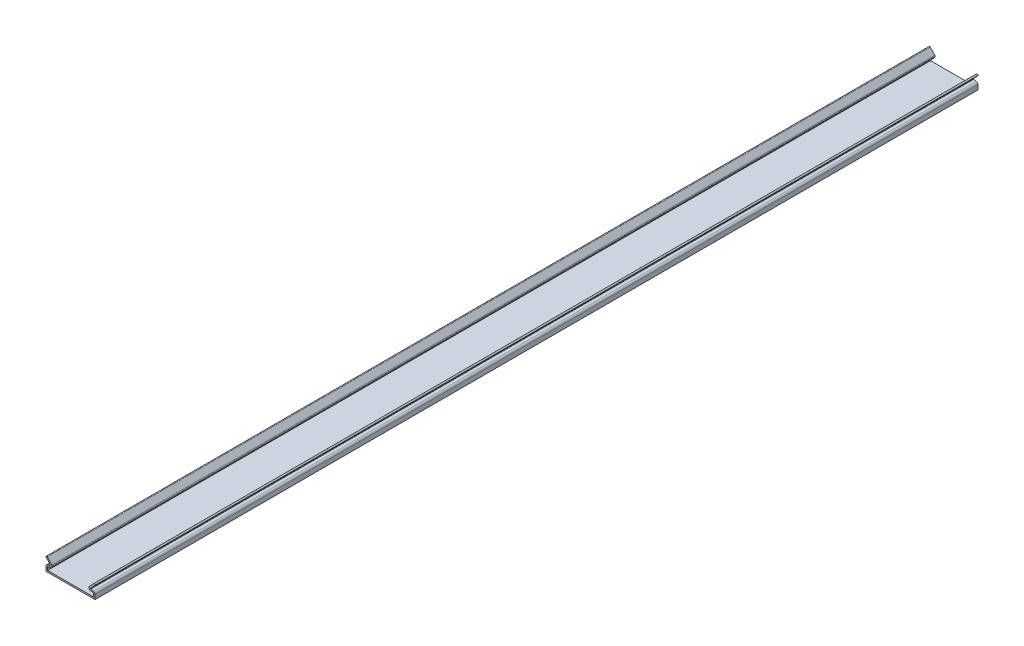
ISO-10303-21;
HEADER;
FILE_DESCRIPTION(('STEP AP214'),'2;1');
FILE_NAME('part.step','',(''),(''),'','','');
FILE_SCHEMA(('AUTOMOTIVE_DESIGN { 1 0 10303 214 1 1 1 1 }'));
ENDSEC;
DATA;
#1=APPLICATION_CONTEXT('core data for automotive mechanical design processes');
#2=APPLICATION_PROTOCOL_DEFINITION('international standard','automotive_design',2000,#1);
#3=PRODUCT_CONTEXT('',#1,'mechanical');
#4=PRODUCT('Part','Part','',(#3));
#5=PRODUCT_RELATED_PRODUCT_CATEGORY('part','',(#4));
#6=PRODUCT_DEFINITION_FORMATION('','',#4);
#7=PRODUCT_DEFINITION_CONTEXT('part definition',#1,'design');
#8=PRODUCT_DEFINITION('design','',#6,#7);
#9=PRODUCT_DEFINITION_SHAPE('','',#8);
#10=(LENGTH_UNIT() NAMED_UNIT(*) SI_UNIT(.MILLI.,.METRE.));
#11=(NAMED_UNIT(*) PLANE_ANGLE_UNIT() SI_UNIT($,.RADIAN.));
#12=(NAMED_UNIT(*) SI_UNIT($,.STERADIAN.) SOLID_ANGLE_UNIT());
#13=UNCERTAINTY_MEASURE_WITH_UNIT(LENGTH_MEASURE(1.E-05),#10,'distance_accuracy_value','');
#14=(GEOMETRIC_REPRESENTATION_CONTEXT(3) GLOBAL_UNCERTAINTY_ASSIGNED_CONTEXT((#13)) GLOBAL_UNIT_ASSIGNED_CONTEXT((#10,
#11,#12)) REPRESENTATION_CONTEXT('',''));
#15=CARTESIAN_POINT('',(0.,0.,0.));
#16=DIRECTION('',(0.,0.,1.));
#17=DIRECTION('',(1.,0.,0.));
#18=AXIS2_PLACEMENT_3D('',#15,#16,#17);
#19=CARTESIAN_POINT('',(6.96256025228649,-71.2888324619271,360.));
#20=DIRECTION('',(0.,1.,0.));
#21=DIRECTION('',(0.,0.,1.));
#22=AXIS2_PLACEMENT_3D('',#19,#20,#21);
#23=PLANE('',#22);
#24=DIRECTION('',(1.,0.,0.));
#25=VECTOR('',#24,1.);
#26=CARTESIAN_POINT('',(6.96256025228649,-71.2888324619271,-360.));
#27=LINE('',#26,#25);
#28=CARTESIAN_POINT('',(6.96256025228649,-71.2888324619271,-360.));
#29=VERTEX_POINT('',#28);
#30=CARTESIAN_POINT('',(46.9625602522865,-71.2888324619271,-360.));
#31=VERTEX_POINT('',#30);
#32=EDGE_CURVE('E255',#29,#31,#27,.T.);
#33=ORIENTED_EDGE('',*,*,#32,.T.);
#34=DIRECTION('',(0.,0.,-1.));
#35=VECTOR('',#34,1.);
#36=CARTESIAN_POINT('',(46.9625602522865,-71.2888324619271,360.));
#37=LINE('',#36,#35);
#38=CARTESIAN_POINT('',(46.9625602522865,-71.2888324619271,360.));
#39=VERTEX_POINT('',#38);
#40=EDGE_CURVE('E11',#39,#31,#37,.T.);
#41=ORIENTED_EDGE('',*,*,#40,.F.);
#42=DIRECTION('',(1.,0.,0.));
#43=VECTOR('',#42,1.);
#44=CARTESIAN_POINT('',(6.96256025228649,-71.2888324619271,360.));
#45=LINE('',#44,#43);
#46=CARTESIAN_POINT('',(6.96256025228649,-71.2888324619271,360.));
#47=VERTEX_POINT('',#46);
#48=EDGE_CURVE('E309',#47,#39,#45,.T.);
#49=ORIENTED_EDGE('',*,*,#48,.F.);
#50=DIRECTION('',(0.,0.,-1.));
#51=VECTOR('',#50,1.);
#52=CARTESIAN_POINT('',(6.96256025228649,-71.2888324619271,360.));
#53=LINE('',#52,#51);
#54=EDGE_CURVE('E251',#47,#29,#53,.T.);
#55=ORIENTED_EDGE('',*,*,#54,.T.);
#56=EDGE_LOOP('',(#33,#41,#49,#55));
#57=FACE_BOUND('',#56,.T.);
#58=ADVANCED_FACE('F39',(#57),#23,.F.);
#59=CARTESIAN_POINT('',(46.9625602522865,-71.2888324619271,360.));
#60=DIRECTION('',(-1.,0.,0.));
#61=DIRECTION('',(0.,0.,1.));
#62=AXIS2_PLACEMENT_3D('',#59,#60,#61);
#63=PLANE('',#62);
#64=DIRECTION('',(0.,1.,0.));
#65=VECTOR('',#64,1.);
#66=CARTESIAN_POINT('',(46.9625602522865,-71.2888324619271,-360.));
#67=LINE('',#66,#65);
#68=CARTESIAN_POINT('',(46.9625602522865,-67.5355315897852,-360.));
#69=VERTEX_POINT('',#68);
#70=EDGE_CURVE('E258',#31,#69,#67,.T.);
#71=ORIENTED_EDGE('',*,*,#70,.T.);
#72=DIRECTION('',(0.,0.,-1.));
#73=VECTOR('',#72,1.);
#74=CARTESIAN_POINT('',(46.9625602522865,-67.5355315897852,360.));
#75=LINE('',#74,#73);
#76=CARTESIAN_POINT('',(46.9625602522865,-67.5355315897852,360.));
#77=VERTEX_POINT('',#76);
#78=EDGE_CURVE('E47',#77,#69,#75,.T.);
#79=ORIENTED_EDGE('',*,*,#78,.F.);
#80=DIRECTION('',(0.,1.,0.));
#81=VECTOR('',#80,1.);
#82=CARTESIAN_POINT('',(46.9625602522865,-71.2888324619271,360.));
#83=LINE('',#82,#81);
#84=EDGE_CURVE('E158',#39,#77,#83,.T.);
#85=ORIENTED_EDGE('',*,*,#84,.F.);
#86=ORIENTED_EDGE('',*,*,#40,.T.);
#87=EDGE_LOOP('',(#71,#79,#85,#86));
#88=FACE_BOUND('',#87,.T.);
#89=ADVANCED_FACE('F467',(#88),#63,.F.);
#90=CARTESIAN_POINT('',(45.3625602522865,-67.5355315897852,360.));
#91=DIRECTION('',(0.,0.,-1.));
#92=DIRECTION('',(-1.,0.,0.));
#93=AXIS2_PLACEMENT_3D('',#90,#91,#92);
#94=CYLINDRICAL_SURFACE('',#93,1.59999999999999);
#95=CARTESIAN_POINT('',(45.3625602522865,-67.5355315897852,-360.));
#96=DIRECTION('',(0.,0.,1.));
#97=DIRECTION('',(1.,0.,0.));
#98=AXIS2_PLACEMENT_3D('',#95,#96,#97);
#99=CIRCLE('',#98,1.59999999999999);
#100=CARTESIAN_POINT('',(45.6403973365536,-65.9598391849657,-360.));
#101=VERTEX_POINT('',#100);
#102=EDGE_CURVE('E260',#69,#101,#99,.T.);
#103=ORIENTED_EDGE('',*,*,#102,.T.);
#104=DIRECTION('',(0.,0.,-1.));
#105=VECTOR('',#104,1.);
#106=CARTESIAN_POINT('',(45.6403973365536,-65.9598391849657,360.));
#107=LINE('',#106,#105);
#108=CARTESIAN_POINT('',(45.6403973365536,-65.9598391849657,360.));
#109=VERTEX_POINT('',#108);
#110=EDGE_CURVE('E376',#109,#101,#107,.T.);
#111=ORIENTED_EDGE('',*,*,#110,.F.);
#112=CARTESIAN_POINT('',(45.3625602522865,-67.5355315897852,360.));
#113=DIRECTION('',(0.,0.,1.));
#114=DIRECTION('',(1.,0.,0.));
#115=AXIS2_PLACEMENT_3D('',#112,#113,#114);
#116=CIRCLE('',#115,1.59999999999999);
#117=EDGE_CURVE('E384',#77,#109,#116,.T.);
#118=ORIENTED_EDGE('',*,*,#117,.F.);
#119=ORIENTED_EDGE('',*,*,#78,.T.);
#120=EDGE_LOOP('',(#103,#111,#118,#119));
#121=FACE_BOUND('',#120,.T.);
#122=ADVANCED_FACE('F382',(#121),#94,.T.);
#123=CARTESIAN_POINT('',(45.6403973365536,-65.9598391849657,360.));
#124=DIRECTION('',(-0.173648177666941,-0.984807753012206,0.));
#125=DIRECTION('',(0.984807753012206,-0.173648177666941,0.));
#126=AXIS2_PLACEMENT_3D('',#123,#124,#125);
#127=PLANE('',#126);
#128=DIRECTION('',(-0.984807753012206,0.173648177666941,0.));
#129=VECTOR('',#128,1.);
#130=CARTESIAN_POINT('',(45.6403973365536,-65.9598391849657,-360.));
#131=LINE('',#130,#129);
#132=CARTESIAN_POINT('',(43.5104657989864,-65.5842747878307,-360.));
#133=VERTEX_POINT('',#132);
#134=EDGE_CURVE('E262',#101,#133,#131,.T.);
#135=ORIENTED_EDGE('',*,*,#134,.T.);
#136=DIRECTION('',(0.,0.,-1.));
#137=VECTOR('',#136,1.);
#138=CARTESIAN_POINT('',(43.5104657989864,-65.5842747878307,360.));
#139=LINE('',#138,#137);
#140=CARTESIAN_POINT('',(43.5104657989864,-65.5842747878307,360.));
#141=VERTEX_POINT('',#140);
#142=EDGE_CURVE('E373',#141,#133,#139,.T.);
#143=ORIENTED_EDGE('',*,*,#142,.F.);
#144=DIRECTION('',(-0.984807753012206,0.173648177666941,0.));
#145=VECTOR('',#144,1.);
#146=CARTESIAN_POINT('',(45.6403973365536,-65.9598391849657,360.));
#147=LINE('',#146,#145);
#148=EDGE_CURVE('E402',#109,#141,#147,.T.);
#149=ORIENTED_EDGE('',*,*,#148,.F.);
#150=ORIENTED_EDGE('',*,*,#110,.T.);
#151=EDGE_LOOP('',(#135,#143,#149,#150));
#152=FACE_BOUND('',#151,.T.);
#153=ADVANCED_FACE('F393',(#152),#127,.F.);
#154=CARTESIAN_POINT('',(43.5625602522865,-65.2888324619271,360.));
#155=DIRECTION('',(0.,0.,-1.));
#156=DIRECTION('',(-1.,0.,0.));
#157=AXIS2_PLACEMENT_3D('',#154,#155,#156);
#158=CYLINDRICAL_SURFACE('',#157,0.299999999999976);
#159=CARTESIAN_POINT('',(43.5625602522865,-65.2888324619271,-360.));
#160=DIRECTION('',(0.,0.,-1.));
#161=DIRECTION('',(1.,0.,0.));
#162=AXIS2_PLACEMENT_3D('',#159,#160,#161);
#163=CIRCLE('',#162,0.299999999999976);
#164=CARTESIAN_POINT('',(43.3431541418008,-65.0842329539084,-360.));
#165=VERTEX_POINT('',#164);
#166=EDGE_CURVE('E264',#133,#165,#163,.T.);
#167=ORIENTED_EDGE('',*,*,#166,.T.);
#168=DIRECTION('',(0.,0.,-1.));
#169=VECTOR('',#168,1.);
#170=CARTESIAN_POINT('',(43.3431541418008,-65.0842329539084,360.));
#171=LINE('',#170,#169);
#172=CARTESIAN_POINT('',(43.3431541418008,-65.0842329539084,360.));
#173=VERTEX_POINT('',#172);
#174=EDGE_CURVE('E370',#173,#165,#171,.T.);
#175=ORIENTED_EDGE('',*,*,#174,.F.);
#176=CARTESIAN_POINT('',(43.5625602522865,-65.2888324619271,360.));
#177=DIRECTION('',(0.,0.,-1.));
#178=DIRECTION('',(1.,0.,0.));
#179=AXIS2_PLACEMENT_3D('',#176,#177,#178);
#180=CIRCLE('',#179,0.299999999999976);
#181=EDGE_CURVE('E399',#141,#173,#180,.T.);
#182=ORIENTED_EDGE('',*,*,#181,.F.);
#183=ORIENTED_EDGE('',*,*,#142,.T.);
#184=EDGE_LOOP('',(#167,#175,#182,#183));
#185=FACE_BOUND('',#184,.T.);
#186=ADVANCED_FACE('F397',(#185),#158,.F.);
#187=CARTESIAN_POINT('',(43.3431541418007,-65.0842329539083,360.));
#188=DIRECTION('',(-0.731353701619174,0.681998360062495,0.));
#189=DIRECTION('',(-0.681998360062495,-0.731353701619174,0.));
#190=AXIS2_PLACEMENT_3D('',#187,#188,#189);
#191=PLANE('',#190);
#192=DIRECTION('',(0.681998360062495,0.731353701619174,0.));
#193=VECTOR('',#192,1.);
#194=CARTESIAN_POINT('',(43.3431541418007,-65.0842329539083,-360.));
#195=LINE('',#194,#193);
#196=CARTESIAN_POINT('',(46.7954196949942,-61.3821313959676,-360.));
#197=VERTEX_POINT('',#196);
#198=EDGE_CURVE('E266',#165,#197,#195,.T.);
#199=ORIENTED_EDGE('',*,*,#198,.T.);
#200=DIRECTION('',(0.,0.,-1.));
#201=VECTOR('',#200,1.);
#202=CARTESIAN_POINT('',(46.7954196949942,-61.3821313959676,360.));
#203=LINE('',#202,#201);
#204=CARTESIAN_POINT('',(46.7954196949942,-61.3821313959676,360.));
#205=VERTEX_POINT('',#204);
#206=EDGE_CURVE('E367',#205,#197,#203,.T.);
#207=ORIENTED_EDGE('',*,*,#206,.F.);
#208=DIRECTION('',(0.681998360062495,0.731353701619174,0.));
#209=VECTOR('',#208,1.);
#210=CARTESIAN_POINT('',(43.3431541418007,-65.0842329539083,360.));
#211=LINE('',#210,#209);
#212=EDGE_CURVE('E401',#173,#205,#211,.T.);
#213=ORIENTED_EDGE('',*,*,#212,.F.);
#214=ORIENTED_EDGE('',*,*,#174,.T.);
#215=EDGE_LOOP('',(#199,#207,#213,#214));
#216=FACE_BOUND('',#215,.T.);
#217=ADVANCED_FACE('F480',(#216),#191,.F.);
#218=CARTESIAN_POINT('',(46.3200397889417,-60.9388324619271,360.));
#219=DIRECTION('',(0.,0.,-1.));
#220=DIRECTION('',(-1.,0.,0.));
#221=AXIS2_PLACEMENT_3D('',#218,#219,#220);
#222=CYLINDRICAL_SURFACE('',#221,0.649999999999958);
#223=CARTESIAN_POINT('',(46.3200397889417,-60.9388324619271,-360.));
#224=DIRECTION('',(0.,0.,1.));
#225=DIRECTION('',(1.,0.,0.));
#226=AXIS2_PLACEMENT_3D('',#223,#224,#225);
#227=CIRCLE('',#226,0.649999999999958);
#228=CARTESIAN_POINT('',(45.8446598828892,-60.4955335278865,-360.));
#229=VERTEX_POINT('',#228);
#230=EDGE_CURVE('E268',#197,#229,#227,.T.);
#231=ORIENTED_EDGE('',*,*,#230,.T.);
#232=DIRECTION('',(0.,0.,-1.));
#233=VECTOR('',#232,1.);
#234=CARTESIAN_POINT('',(45.8446598828892,-60.4955335278865,360.));
#235=LINE('',#234,#233);
#236=CARTESIAN_POINT('',(45.8446598828892,-60.4955335278865,360.));
#237=VERTEX_POINT('',#236);
#238=EDGE_CURVE('E364',#237,#229,#235,.T.);
#239=ORIENTED_EDGE('',*,*,#238,.F.);
#240=CARTESIAN_POINT('',(46.3200397889417,-60.9388324619271,360.));
#241=DIRECTION('',(0.,0.,1.));
#242=DIRECTION('',(1.,0.,0.));
#243=AXIS2_PLACEMENT_3D('',#240,#241,#242);
#244=CIRCLE('',#243,0.649999999999958);
#245=EDGE_CURVE('E404',#205,#237,#244,.T.);
#246=ORIENTED_EDGE('',*,*,#245,.F.);
#247=ORIENTED_EDGE('',*,*,#206,.T.);
#248=EDGE_LOOP('',(#231,#239,#246,#247));
#249=FACE_BOUND('',#248,.T.);
#250=ADVANCED_FACE('F483',(#249),#222,.T.);
#251=CARTESIAN_POINT('',(45.8446598828892,-60.4955335278865,360.));
#252=DIRECTION('',(0.731353701619166,-0.681998360062503,0.));
#253=DIRECTION('',(0.681998360062503,0.731353701619167,0.));
#254=AXIS2_PLACEMENT_3D('',#251,#252,#253);
#255=PLANE('',#254);
#256=DIRECTION('',(-0.681998360062503,-0.731353701619166,0.));
#257=VECTOR('',#256,1.);
#258=CARTESIAN_POINT('',(45.8446598828892,-60.4955335278865,-360.));
#259=LINE('',#258,#257);
#260=CARTESIAN_POINT('',(42.2312065506673,-64.3704878164957,-360.));
#261=VERTEX_POINT('',#260);
#262=EDGE_CURVE('E270',#229,#261,#259,.T.);
#263=ORIENTED_EDGE('',*,*,#262,.T.);
#264=DIRECTION('',(0.,0.,-1.));
#265=VECTOR('',#264,1.);
#266=CARTESIAN_POINT('',(42.2312065506673,-64.3704878164957,360.));
#267=LINE('',#266,#265);
#268=CARTESIAN_POINT('',(42.2312065506673,-64.3704878164957,360.));
#269=VERTEX_POINT('',#268);
#270=EDGE_CURVE('E361',#269,#261,#267,.T.);
#271=ORIENTED_EDGE('',*,*,#270,.F.);
#272=DIRECTION('',(-0.681998360062503,-0.731353701619166,0.));
#273=VECTOR('',#272,1.);
#274=CARTESIAN_POINT('',(45.8446598828892,-60.4955335278865,360.));
#275=LINE('',#274,#273);
#276=EDGE_CURVE('E410',#237,#269,#275,.T.);
#277=ORIENTED_EDGE('',*,*,#276,.F.);
#278=ORIENTED_EDGE('',*,*,#238,.T.);
#279=EDGE_LOOP('',(#263,#271,#277,#278));
#280=FACE_BOUND('',#279,.T.);
#281=ADVANCED_FACE('F487',(#280),#255,.F.);
#282=CARTESIAN_POINT('',(42.9625602522865,-65.0524861765581,360.));
#283=DIRECTION('',(0.,0.,-1.));
#284=DIRECTION('',(-1.,0.,0.));
#285=AXIS2_PLACEMENT_3D('',#282,#283,#284);
#286=CYLINDRICAL_SURFACE('',#285,0.999999999999971);
#287=CARTESIAN_POINT('',(42.9625602522865,-65.0524861765581,-360.));
#288=DIRECTION('',(0.,0.,1.));
#289=DIRECTION('',(1.,0.,0.));
#290=AXIS2_PLACEMENT_3D('',#287,#288,#289);
#291=CIRCLE('',#290,0.999999999999971);
#292=CARTESIAN_POINT('',(41.9625602522865,-65.0524861765582,-360.));
#293=VERTEX_POINT('',#292);
#294=EDGE_CURVE('E272',#261,#293,#291,.T.);
#295=ORIENTED_EDGE('',*,*,#294,.T.);
#296=DIRECTION('',(0.,0.,-1.));
#297=VECTOR('',#296,1.);
#298=CARTESIAN_POINT('',(41.9625602522865,-65.0524861765582,360.));
#299=LINE('',#298,#297);
#300=CARTESIAN_POINT('',(41.9625602522865,-65.0524861765582,360.));
#301=VERTEX_POINT('',#300);
#302=EDGE_CURVE('E358',#301,#293,#299,.T.);
#303=ORIENTED_EDGE('',*,*,#302,.F.);
#304=CARTESIAN_POINT('',(42.9625602522865,-65.0524861765581,360.));
#305=DIRECTION('',(0.,0.,1.));
#306=DIRECTION('',(1.,0.,0.));
#307=AXIS2_PLACEMENT_3D('',#304,#305,#306);
#308=CIRCLE('',#307,0.999999999999971);
#309=EDGE_CURVE('E412',#269,#301,#308,.T.);
#310=ORIENTED_EDGE('',*,*,#309,.F.);
#311=ORIENTED_EDGE('',*,*,#270,.T.);
#312=EDGE_LOOP('',(#295,#303,#310,#311));
#313=FACE_BOUND('',#312,.T.);
#314=ADVANCED_FACE('F491',(#313),#286,.T.);
#315=CARTESIAN_POINT('',(41.9625602522865,-65.0524861765582,360.));
#316=DIRECTION('',(1.,0.,0.));
#317=DIRECTION('',(0.,1.,0.));
#318=AXIS2_PLACEMENT_3D('',#315,#316,#317);
#319=PLANE('',#318);
#320=DIRECTION('',(0.,-1.,0.));
#321=VECTOR('',#320,1.);
#322=CARTESIAN_POINT('',(41.9625602522865,-65.0524861765582,-360.));
#323=LINE('',#322,#321);
#324=CARTESIAN_POINT('',(41.9625602522865,-65.2888324619273,-360.));
#325=VERTEX_POINT('',#324);
#326=EDGE_CURVE('E274',#293,#325,#323,.T.);
#327=ORIENTED_EDGE('',*,*,#326,.T.);
#328=DIRECTION('',(0.,0.,-1.));
#329=VECTOR('',#328,1.);
#330=CARTESIAN_POINT('',(41.9625602522865,-65.2888324619273,360.));
#331=LINE('',#330,#329);
#332=CARTESIAN_POINT('',(41.9625602522865,-65.2888324619273,360.));
#333=VERTEX_POINT('',#332);
#334=EDGE_CURVE('E355',#333,#325,#331,.T.);
#335=ORIENTED_EDGE('',*,*,#334,.F.);
#336=DIRECTION('',(0.,-1.,0.));
#337=VECTOR('',#336,1.);
#338=CARTESIAN_POINT('',(41.9625602522865,-65.0524861765582,360.));
#339=LINE('',#338,#337);
#340=EDGE_CURVE('E414',#301,#333,#339,.T.);
#341=ORIENTED_EDGE('',*,*,#340,.F.);
#342=ORIENTED_EDGE('',*,*,#302,.T.);
#343=EDGE_LOOP('',(#327,#335,#341,#342));
#344=FACE_BOUND('',#343,.T.);
#345=ADVANCED_FACE('F495',(#344),#319,.F.);
#346=CARTESIAN_POINT('',(43.5625602522865,-65.2888324619271,360.));
#347=DIRECTION('',(0.,0.,-1.));
#348=DIRECTION('',(-1.,0.,0.));
#349=AXIS2_PLACEMENT_3D('',#346,#347,#348);
#350=CYLINDRICAL_SURFACE('',#349,1.59999999999999);
#351=CARTESIAN_POINT('',(43.5625602522865,-65.2888324619271,-360.));
#352=DIRECTION('',(0.,0.,1.));
#353=DIRECTION('',(1.,0.,0.));
#354=AXIS2_PLACEMENT_3D('',#351,#352,#353);
#355=CIRCLE('',#354,1.59999999999999);
#356=CARTESIAN_POINT('',(43.2847231680194,-66.8645248667466,-360.));
#357=VERTEX_POINT('',#356);
#358=EDGE_CURVE('E276',#325,#357,#355,.T.);
#359=ORIENTED_EDGE('',*,*,#358,.T.);
#360=DIRECTION('',(0.,0.,-1.));
#361=VECTOR('',#360,1.);
#362=CARTESIAN_POINT('',(43.2847231680194,-66.8645248667466,360.));
#363=LINE('',#362,#361);
#364=CARTESIAN_POINT('',(43.2847231680194,-66.8645248667466,360.));
#365=VERTEX_POINT('',#364);
#366=EDGE_CURVE('E352',#365,#357,#363,.T.);
#367=ORIENTED_EDGE('',*,*,#366,.F.);
#368=CARTESIAN_POINT('',(43.5625602522865,-65.2888324619271,360.));
#369=DIRECTION('',(0.,0.,1.));
#370=DIRECTION('',(1.,0.,0.));
#371=AXIS2_PLACEMENT_3D('',#368,#369,#370);
#372=CIRCLE('',#371,1.59999999999999);
#373=EDGE_CURVE('E416',#333,#365,#372,.T.);
#374=ORIENTED_EDGE('',*,*,#373,.F.);
#375=ORIENTED_EDGE('',*,*,#334,.T.);
#376=EDGE_LOOP('',(#359,#367,#374,#375));
#377=FACE_BOUND('',#376,.T.);
#378=ADVANCED_FACE('F499',(#377),#350,.T.);
#379=CARTESIAN_POINT('',(43.2847231680194,-66.8645248667466,360.));
#380=DIRECTION('',(0.173648177666941,0.984807753012206,0.));
#381=DIRECTION('',(-0.984807753012206,0.173648177666941,0.));
#382=AXIS2_PLACEMENT_3D('',#379,#380,#381);
#383=PLANE('',#382);
#384=DIRECTION('',(0.984807753012206,-0.173648177666941,0.));
#385=VECTOR('',#384,1.);
#386=CARTESIAN_POINT('',(43.2847231680194,-66.8645248667466,-360.));
#387=LINE('',#386,#385);
#388=CARTESIAN_POINT('',(45.4146547055866,-67.2400892638816,-360.));
#389=VERTEX_POINT('',#388);
#390=EDGE_CURVE('E278',#357,#389,#387,.T.);
#391=ORIENTED_EDGE('',*,*,#390,.T.);
#392=DIRECTION('',(0.,0.,-1.));
#393=VECTOR('',#392,1.);
#394=CARTESIAN_POINT('',(45.4146547055866,-67.2400892638816,360.));
#395=LINE('',#394,#393);
#396=CARTESIAN_POINT('',(45.4146547055866,-67.2400892638816,360.));
#397=VERTEX_POINT('',#396);
#398=EDGE_CURVE('E349',#397,#389,#395,.T.);
#399=ORIENTED_EDGE('',*,*,#398,.F.);
#400=DIRECTION('',(0.984807753012206,-0.173648177666941,0.));
#401=VECTOR('',#400,1.);
#402=CARTESIAN_POINT('',(43.2847231680194,-66.8645248667466,360.));
#403=LINE('',#402,#401);
#404=EDGE_CURVE('E418',#365,#397,#403,.T.);
#405=ORIENTED_EDGE('',*,*,#404,.F.);
#406=ORIENTED_EDGE('',*,*,#366,.T.);
#407=EDGE_LOOP('',(#391,#399,#405,#406));
#408=FACE_BOUND('',#407,.T.);
#409=ADVANCED_FACE('F503',(#408),#383,.F.);
#410=CARTESIAN_POINT('',(45.3625602522865,-67.5355315897852,360.));
#411=DIRECTION('',(0.,0.,-1.));
#412=DIRECTION('',(-1.,0.,0.));
#413=AXIS2_PLACEMENT_3D('',#410,#411,#412);
#414=CYLINDRICAL_SURFACE('',#413,0.299999999999959);
#415=CARTESIAN_POINT('',(45.3625602522865,-67.5355315897852,-360.));
#416=DIRECTION('',(0.,0.,-1.));
#417=DIRECTION('',(1.,0.,0.));
#418=AXIS2_PLACEMENT_3D('',#415,#416,#417);
#419=CIRCLE('',#418,0.299999999999959);
#420=CARTESIAN_POINT('',(45.6625602522865,-67.5355315897852,-360.));
#421=VERTEX_POINT('',#420);
#422=EDGE_CURVE('E280',#389,#421,#419,.T.);
#423=ORIENTED_EDGE('',*,*,#422,.T.);
#424=DIRECTION('',(0.,0.,-1.));
#425=VECTOR('',#424,1.);
#426=CARTESIAN_POINT('',(45.6625602522865,-67.5355315897852,360.));
#427=LINE('',#426,#425);
#428=CARTESIAN_POINT('',(45.6625602522865,-67.5355315897852,360.));
#429=VERTEX_POINT('',#428);
#430=EDGE_CURVE('E346',#429,#421,#427,.T.);
#431=ORIENTED_EDGE('',*,*,#430,.F.);
#432=CARTESIAN_POINT('',(45.3625602522865,-67.5355315897852,360.));
#433=DIRECTION('',(0.,0.,-1.));
#434=DIRECTION('',(1.,0.,0.));
#435=AXIS2_PLACEMENT_3D('',#432,#433,#434);
#436=CIRCLE('',#435,0.299999999999959);
#437=EDGE_CURVE('E420',#397,#429,#436,.T.);
#438=ORIENTED_EDGE('',*,*,#437,.F.);
#439=ORIENTED_EDGE('',*,*,#398,.T.);
#440=EDGE_LOOP('',(#423,#431,#438,#439));
#441=FACE_BOUND('',#440,.T.);
#442=ADVANCED_FACE('F507',(#441),#414,.F.);
#443=CARTESIAN_POINT('',(45.6625602522865,-67.5355315897852,360.));
#444=DIRECTION('',(1.,0.,0.));
#445=DIRECTION('',(0.,1.,0.));
#446=AXIS2_PLACEMENT_3D('',#443,#444,#445);
#447=PLANE('',#446);
#448=DIRECTION('',(0.,-1.,0.));
#449=VECTOR('',#448,1.);
#450=CARTESIAN_POINT('',(45.6625602522865,-67.5355315897852,-360.));
#451=LINE('',#450,#449);
#452=CARTESIAN_POINT('',(45.6625602522865,-69.9888324619271,-360.));
#453=VERTEX_POINT('',#452);
#454=EDGE_CURVE('E282',#421,#453,#451,.T.);
#455=ORIENTED_EDGE('',*,*,#454,.T.);
#456=DIRECTION('',(0.,0.,-1.));
#457=VECTOR('',#456,1.);
#458=CARTESIAN_POINT('',(45.6625602522865,-69.9888324619271,360.));
#459=LINE('',#458,#457);
#460=CARTESIAN_POINT('',(45.6625602522865,-69.9888324619271,360.));
#461=VERTEX_POINT('',#460);
#462=EDGE_CURVE('E343',#461,#453,#459,.T.);
#463=ORIENTED_EDGE('',*,*,#462,.F.);
#464=DIRECTION('',(0.,-1.,0.));
#465=VECTOR('',#464,1.);
#466=CARTESIAN_POINT('',(45.6625602522865,-67.5355315897852,360.));
#467=LINE('',#466,#465);
#468=EDGE_CURVE('E422',#429,#461,#467,.T.);
#469=ORIENTED_EDGE('',*,*,#468,.F.);
#470=ORIENTED_EDGE('',*,*,#430,.T.);
#471=EDGE_LOOP('',(#455,#463,#469,#470));
#472=FACE_BOUND('',#471,.T.);
#473=ADVANCED_FACE('F511',(#472),#447,.F.);
#474=CARTESIAN_POINT('',(45.6625602522865,-69.9888324619271,360.));
#475=DIRECTION('',(0.,-1.,0.));
#476=DIRECTION('',(0.,0.,-1.));
#477=AXIS2_PLACEMENT_3D('',#474,#475,#476);
#478=PLANE('',#477);
#479=DIRECTION('',(-1.,0.,0.));
#480=VECTOR('',#479,1.);
#481=CARTESIAN_POINT('',(45.6625602522865,-69.9888324619271,-360.));
#482=LINE('',#481,#480);
#483=CARTESIAN_POINT('',(8.26256025228649,-69.9888324619271,-360.));
#484=VERTEX_POINT('',#483);
#485=EDGE_CURVE('E284',#453,#484,#482,.T.);
#486=ORIENTED_EDGE('',*,*,#485,.T.);
#487=DIRECTION('',(0.,0.,-1.));
#488=VECTOR('',#487,1.);
#489=CARTESIAN_POINT('',(8.26256025228649,-69.9888324619271,360.));
#490=LINE('',#489,#488);
#491=CARTESIAN_POINT('',(8.26256025228649,-69.9888324619271,360.));
#492=VERTEX_POINT('',#491);
#493=EDGE_CURVE('E340',#492,#484,#490,.T.);
#494=ORIENTED_EDGE('',*,*,#493,.F.);
#495=DIRECTION('',(-1.,0.,0.));
#496=VECTOR('',#495,1.);
#497=CARTESIAN_POINT('',(45.6625602522865,-69.9888324619271,360.));
#498=LINE('',#497,#496);
#499=EDGE_CURVE('E424',#461,#492,#498,.T.);
#500=ORIENTED_EDGE('',*,*,#499,.F.);
#501=ORIENTED_EDGE('',*,*,#462,.T.);
#502=EDGE_LOOP('',(#486,#494,#500,#501));
#503=FACE_BOUND('',#502,.T.);
#504=ADVANCED_FACE('F515',(#503),#478,.F.);
#505=CARTESIAN_POINT('',(8.26256025228649,-69.9888324619271,360.));
#506=DIRECTION('',(-1.,0.,0.));
#507=DIRECTION('',(0.,0.,1.));
#508=AXIS2_PLACEMENT_3D('',#505,#506,#507);
#509=PLANE('',#508);
#510=DIRECTION('',(0.,1.,0.));
#511=VECTOR('',#510,1.);
#512=CARTESIAN_POINT('',(8.26256025228649,-69.9888324619271,-360.));
#513=LINE('',#512,#511);
#514=CARTESIAN_POINT('',(8.26256025228649,-67.5355315897853,-360.));
#515=VERTEX_POINT('',#514);
#516=EDGE_CURVE('E286',#484,#515,#513,.T.);
#517=ORIENTED_EDGE('',*,*,#516,.T.);
#518=DIRECTION('',(0.,0.,-1.));
#519=VECTOR('',#518,1.);
#520=CARTESIAN_POINT('',(8.26256025228649,-67.5355315897853,360.));
#521=LINE('',#520,#519);
#522=CARTESIAN_POINT('',(8.26256025228649,-67.5355315897853,360.));
#523=VERTEX_POINT('',#522);
#524=EDGE_CURVE('E337',#523,#515,#521,.T.);
#525=ORIENTED_EDGE('',*,*,#524,.F.);
#526=DIRECTION('',(0.,1.,0.));
#527=VECTOR('',#526,1.);
#528=CARTESIAN_POINT('',(8.26256025228649,-69.9888324619271,360.));
#529=LINE('',#528,#527);
#530=EDGE_CURVE('E426',#492,#523,#529,.T.);
#531=ORIENTED_EDGE('',*,*,#530,.F.);
#532=ORIENTED_EDGE('',*,*,#493,.T.);
#533=EDGE_LOOP('',(#517,#525,#531,#532));
#534=FACE_BOUND('',#533,.T.);
#535=ADVANCED_FACE('F519',(#534),#509,.F.);
#536=CARTESIAN_POINT('',(8.56256025228649,-67.5355315897853,360.));
#537=DIRECTION('',(0.,0.,-1.));
#538=DIRECTION('',(-1.,0.,0.));
#539=AXIS2_PLACEMENT_3D('',#536,#537,#538);
#540=CYLINDRICAL_SURFACE('',#539,0.300000000000014);
#541=CARTESIAN_POINT('',(8.56256025228649,-67.5355315897853,-360.));
#542=DIRECTION('',(0.,0.,-1.));
#543=DIRECTION('',(1.,0.,0.));
#544=AXIS2_PLACEMENT_3D('',#541,#542,#543);
#545=CIRCLE('',#544,0.300000000000014);
#546=CARTESIAN_POINT('',(8.5104657989864,-67.2400892638816,-360.));
#547=VERTEX_POINT('',#546);
#548=EDGE_CURVE('E288',#515,#547,#545,.T.);
#549=ORIENTED_EDGE('',*,*,#548,.T.);
#550=DIRECTION('',(0.,0.,-1.));
#551=VECTOR('',#550,1.);
#552=CARTESIAN_POINT('',(8.5104657989864,-67.2400892638816,360.));
#553=LINE('',#552,#551);
#554=CARTESIAN_POINT('',(8.5104657989864,-67.2400892638816,360.));
#555=VERTEX_POINT('',#554);
#556=EDGE_CURVE('E334',#555,#547,#553,.T.);
#557=ORIENTED_EDGE('',*,*,#556,.F.);
#558=CARTESIAN_POINT('',(8.56256025228649,-67.5355315897853,360.));
#559=DIRECTION('',(0.,0.,-1.));
#560=DIRECTION('',(1.,0.,0.));
#561=AXIS2_PLACEMENT_3D('',#558,#559,#560);
#562=CIRCLE('',#561,0.300000000000014);
#563=EDGE_CURVE('E428',#523,#555,#562,.T.);
#564=ORIENTED_EDGE('',*,*,#563,.F.);
#565=ORIENTED_EDGE('',*,*,#524,.T.);
#566=EDGE_LOOP('',(#549,#557,#564,#565));
#567=FACE_BOUND('',#566,.T.);
#568=ADVANCED_FACE('F523',(#567),#540,.F.);
#569=CARTESIAN_POINT('',(8.5104657989864,-67.2400892638816,360.));
#570=DIRECTION('',(-0.173648177666954,0.984807753012204,0.));
#571=DIRECTION('',(-0.984807753012204,-0.173648177666954,0.));
#572=AXIS2_PLACEMENT_3D('',#569,#570,#571);
#573=PLANE('',#572);
#574=DIRECTION('',(0.984807753012204,0.173648177666954,0.));
#575=VECTOR('',#574,1.);
#576=CARTESIAN_POINT('',(8.5104657989864,-67.2400892638816,-360.));
#577=LINE('',#576,#575);
#578=CARTESIAN_POINT('',(10.6403973365536,-66.8645248667466,-360.));
#579=VERTEX_POINT('',#578);
#580=EDGE_CURVE('E290',#547,#579,#577,.T.);
#581=ORIENTED_EDGE('',*,*,#580,.T.);
#582=DIRECTION('',(0.,0.,-1.));
#583=VECTOR('',#582,1.);
#584=CARTESIAN_POINT('',(10.6403973365536,-66.8645248667466,360.));
#585=LINE('',#584,#583);
#586=CARTESIAN_POINT('',(10.6403973365536,-66.8645248667466,360.));
#587=VERTEX_POINT('',#586);
#588=EDGE_CURVE('E331',#587,#579,#585,.T.);
#589=ORIENTED_EDGE('',*,*,#588,.F.);
#590=DIRECTION('',(0.984807753012204,0.173648177666954,0.));
#591=VECTOR('',#590,1.);
#592=CARTESIAN_POINT('',(8.5104657989864,-67.2400892638816,360.));
#593=LINE('',#592,#591);
#594=EDGE_CURVE('E430',#555,#587,#593,.T.);
#595=ORIENTED_EDGE('',*,*,#594,.F.);
#596=ORIENTED_EDGE('',*,*,#556,.T.);
#597=EDGE_LOOP('',(#581,#589,#595,#596));
#598=FACE_BOUND('',#597,.T.);
#599=ADVANCED_FACE('F527',(#598),#573,.F.);
#600=CARTESIAN_POINT('',(10.3625602522865,-65.2888324619271,360.));
#601=DIRECTION('',(0.,0.,-1.));
#602=DIRECTION('',(-1.,0.,0.));
#603=AXIS2_PLACEMENT_3D('',#600,#601,#602);
#604=CYLINDRICAL_SURFACE('',#603,1.59999999999998);
#605=CARTESIAN_POINT('',(10.3625602522865,-65.2888324619271,-360.));
#606=DIRECTION('',(0.,0.,1.));
#607=DIRECTION('',(1.,0.,0.));
#608=AXIS2_PLACEMENT_3D('',#605,#606,#607);
#609=CIRCLE('',#608,1.59999999999998);
#610=CARTESIAN_POINT('',(11.9625602522865,-65.2888324619271,-360.));
#611=VERTEX_POINT('',#610);
#612=EDGE_CURVE('E292',#579,#611,#609,.T.);
#613=ORIENTED_EDGE('',*,*,#612,.T.);
#614=DIRECTION('',(0.,0.,-1.));
#615=VECTOR('',#614,1.);
#616=CARTESIAN_POINT('',(11.9625602522865,-65.2888324619271,360.));
#617=LINE('',#616,#615);
#618=CARTESIAN_POINT('',(11.9625602522865,-65.2888324619271,360.));
#619=VERTEX_POINT('',#618);
#620=EDGE_CURVE('E328',#619,#611,#617,.T.);
#621=ORIENTED_EDGE('',*,*,#620,.F.);
#622=CARTESIAN_POINT('',(10.3625602522865,-65.2888324619271,360.));
#623=DIRECTION('',(0.,0.,1.));
#624=DIRECTION('',(1.,0.,0.));
#625=AXIS2_PLACEMENT_3D('',#622,#623,#624);
#626=CIRCLE('',#625,1.59999999999998);
#627=EDGE_CURVE('E432',#587,#619,#626,.T.);
#628=ORIENTED_EDGE('',*,*,#627,.F.);
#629=ORIENTED_EDGE('',*,*,#588,.T.);
#630=EDGE_LOOP('',(#613,#621,#628,#629));
#631=FACE_BOUND('',#630,.T.);
#632=ADVANCED_FACE('F531',(#631),#604,.T.);
#633=CARTESIAN_POINT('',(11.9625602522865,-65.2888324619271,360.));
#634=DIRECTION('',(-1.,0.,0.));
#635=DIRECTION('',(0.,-1.,0.));
#636=AXIS2_PLACEMENT_3D('',#633,#634,#635);
#637=PLANE('',#636);
#638=DIRECTION('',(0.,1.,0.));
#639=VECTOR('',#638,1.);
#640=CARTESIAN_POINT('',(11.9625602522865,-65.2888324619271,-360.));
#641=LINE('',#640,#639);
#642=CARTESIAN_POINT('',(11.9625602522865,-65.0524861765581,-360.));
#643=VERTEX_POINT('',#642);
#644=EDGE_CURVE('E294',#611,#643,#641,.T.);
#645=ORIENTED_EDGE('',*,*,#644,.T.);
#646=DIRECTION('',(0.,0.,-1.));
#647=VECTOR('',#646,1.);
#648=CARTESIAN_POINT('',(11.9625602522865,-65.0524861765581,360.));
#649=LINE('',#648,#647);
#650=CARTESIAN_POINT('',(11.9625602522865,-65.0524861765581,360.));
#651=VERTEX_POINT('',#650);
#652=EDGE_CURVE('E325',#651,#643,#649,.T.);
#653=ORIENTED_EDGE('',*,*,#652,.F.);
#654=DIRECTION('',(0.,1.,0.));
#655=VECTOR('',#654,1.);
#656=CARTESIAN_POINT('',(11.9625602522865,-65.2888324619271,360.));
#657=LINE('',#656,#655);
#658=EDGE_CURVE('E434',#619,#651,#657,.T.);
#659=ORIENTED_EDGE('',*,*,#658,.F.);
#660=ORIENTED_EDGE('',*,*,#620,.T.);
#661=EDGE_LOOP('',(#645,#653,#659,#660));
#662=FACE_BOUND('',#661,.T.);
#663=ADVANCED_FACE('F535',(#662),#637,.F.);
#664=CARTESIAN_POINT('',(10.9625602522865,-65.0524861765581,360.));
#665=DIRECTION('',(0.,0.,-1.));
#666=DIRECTION('',(-1.,0.,0.));
#667=AXIS2_PLACEMENT_3D('',#664,#665,#666);
#668=CYLINDRICAL_SURFACE('',#667,0.999999999999992);
#669=CARTESIAN_POINT('',(10.9625602522865,-65.0524861765581,-360.));
#670=DIRECTION('',(0.,0.,1.));
#671=DIRECTION('',(1.,0.,0.));
#672=AXIS2_PLACEMENT_3D('',#669,#670,#671);
#673=CIRCLE('',#672,0.999999999999992);
#674=CARTESIAN_POINT('',(11.6939139539057,-64.3704878164957,-360.));
#675=VERTEX_POINT('',#674);
#676=EDGE_CURVE('E296',#643,#675,#673,.T.);
#677=ORIENTED_EDGE('',*,*,#676,.T.);
#678=DIRECTION('',(0.,0.,-1.));
#679=VECTOR('',#678,1.);
#680=CARTESIAN_POINT('',(11.6939139539057,-64.3704878164957,360.));
#681=LINE('',#680,#679);
#682=CARTESIAN_POINT('',(11.6939139539057,-64.3704878164957,360.));
#683=VERTEX_POINT('',#682);
#684=EDGE_CURVE('E322',#683,#675,#681,.T.);
#685=ORIENTED_EDGE('',*,*,#684,.F.);
#686=CARTESIAN_POINT('',(10.9625602522865,-65.0524861765581,360.));
#687=DIRECTION('',(0.,0.,1.));
#688=DIRECTION('',(1.,0.,0.));
#689=AXIS2_PLACEMENT_3D('',#686,#687,#688);
#690=CIRCLE('',#689,0.999999999999992);
#691=EDGE_CURVE('E436',#651,#683,#690,.T.);
#692=ORIENTED_EDGE('',*,*,#691,.F.);
#693=ORIENTED_EDGE('',*,*,#652,.T.);
#694=EDGE_LOOP('',(#677,#685,#692,#693));
#695=FACE_BOUND('',#694,.T.);
#696=ADVANCED_FACE('F539',(#695),#668,.T.);
#697=CARTESIAN_POINT('',(11.6939139539057,-64.3704878164957,360.));
#698=DIRECTION('',(-0.731353701619168,-0.681998360062501,0.));
#699=DIRECTION('',(0.681998360062501,-0.731353701619168,0.));
#700=AXIS2_PLACEMENT_3D('',#697,#698,#699);
#701=PLANE('',#700);
#702=DIRECTION('',(-0.681998360062501,0.731353701619168,0.));
#703=VECTOR('',#702,1.);
#704=CARTESIAN_POINT('',(11.6939139539057,-64.3704878164957,-360.));
#705=LINE('',#704,#703);
#706=CARTESIAN_POINT('',(8.0804606216838,-60.4955335278865,-360.));
#707=VERTEX_POINT('',#706);
#708=EDGE_CURVE('E298',#675,#707,#705,.T.);
#709=ORIENTED_EDGE('',*,*,#708,.T.);
#710=DIRECTION('',(0.,0.,-1.));
#711=VECTOR('',#710,1.);
#712=CARTESIAN_POINT('',(8.0804606216838,-60.4955335278865,360.));
#713=LINE('',#712,#711);
#714=CARTESIAN_POINT('',(8.0804606216838,-60.4955335278865,360.));
#715=VERTEX_POINT('',#714);
#716=EDGE_CURVE('E319',#715,#707,#713,.T.);
#717=ORIENTED_EDGE('',*,*,#716,.F.);
#718=DIRECTION('',(-0.681998360062501,0.731353701619168,0.));
#719=VECTOR('',#718,1.);
#720=CARTESIAN_POINT('',(11.6939139539057,-64.3704878164957,360.));
#721=LINE('',#720,#719);
#722=EDGE_CURVE('E438',#683,#715,#721,.T.);
#723=ORIENTED_EDGE('',*,*,#722,.F.);
#724=ORIENTED_EDGE('',*,*,#684,.T.);
#725=EDGE_LOOP('',(#709,#717,#723,#724));
#726=FACE_BOUND('',#725,.T.);
#727=ADVANCED_FACE('F543',(#726),#701,.F.);
#728=CARTESIAN_POINT('',(7.60508071563129,-60.9388324619271,360.));
#729=DIRECTION('',(0.,0.,-1.));
#730=DIRECTION('',(-1.,0.,0.));
#731=AXIS2_PLACEMENT_3D('',#728,#729,#730);
#732=CYLINDRICAL_SURFACE('',#731,0.650000000000011);
#733=CARTESIAN_POINT('',(7.60508071563129,-60.9388324619271,-360.));
#734=DIRECTION('',(0.,0.,1.));
#735=DIRECTION('',(1.,0.,0.));
#736=AXIS2_PLACEMENT_3D('',#733,#734,#735);
#737=CIRCLE('',#736,0.650000000000011);
#738=CARTESIAN_POINT('',(7.12970080957889,-61.3821313959678,-360.));
#739=VERTEX_POINT('',#738);
#740=EDGE_CURVE('E300',#707,#739,#737,.T.);
#741=ORIENTED_EDGE('',*,*,#740,.T.);
#742=DIRECTION('',(0.,0.,-1.));
#743=VECTOR('',#742,1.);
#744=CARTESIAN_POINT('',(7.12970080957889,-61.3821313959678,360.));
#745=LINE('',#744,#743);
#746=CARTESIAN_POINT('',(7.12970080957889,-61.3821313959678,360.));
#747=VERTEX_POINT('',#746);
#748=EDGE_CURVE('E316',#747,#739,#745,.T.);
#749=ORIENTED_EDGE('',*,*,#748,.F.);
#750=CARTESIAN_POINT('',(7.60508071563129,-60.9388324619271,360.));
#751=DIRECTION('',(0.,0.,1.));
#752=DIRECTION('',(1.,0.,0.));
#753=AXIS2_PLACEMENT_3D('',#750,#751,#752);
#754=CIRCLE('',#753,0.650000000000011);
#755=EDGE_CURVE('E440',#715,#747,#754,.T.);
#756=ORIENTED_EDGE('',*,*,#755,.F.);
#757=ORIENTED_EDGE('',*,*,#716,.T.);
#758=EDGE_LOOP('',(#741,#749,#756,#757));
#759=FACE_BOUND('',#758,.T.);
#760=ADVANCED_FACE('F547',(#759),#732,.T.);
#761=CARTESIAN_POINT('',(7.12970080957889,-61.3821313959678,360.));
#762=DIRECTION('',(0.731353701619165,0.681998360062504,0.));
#763=DIRECTION('',(-0.681998360062504,0.731353701619165,0.));
#764=AXIS2_PLACEMENT_3D('',#761,#762,#763);
#765=PLANE('',#764);
#766=DIRECTION('',(0.681998360062504,-0.731353701619165,0.));
#767=VECTOR('',#766,1.);
#768=CARTESIAN_POINT('',(7.12970080957889,-61.3821313959678,-360.));
#769=LINE('',#768,#767);
#770=CARTESIAN_POINT('',(10.5819663627723,-65.0842329539084,-360.));
#771=VERTEX_POINT('',#770);
#772=EDGE_CURVE('E302',#739,#771,#769,.T.);
#773=ORIENTED_EDGE('',*,*,#772,.T.);
#774=DIRECTION('',(0.,0.,-1.));
#775=VECTOR('',#774,1.);
#776=CARTESIAN_POINT('',(10.5819663627723,-65.0842329539084,360.));
#777=LINE('',#776,#775);
#778=CARTESIAN_POINT('',(10.5819663627723,-65.0842329539084,360.));
#779=VERTEX_POINT('',#778);
#780=EDGE_CURVE('E313',#779,#771,#777,.T.);
#781=ORIENTED_EDGE('',*,*,#780,.F.);
#782=DIRECTION('',(0.681998360062504,-0.731353701619165,0.));
#783=VECTOR('',#782,1.);
#784=CARTESIAN_POINT('',(7.12970080957889,-61.3821313959678,360.));
#785=LINE('',#784,#783);
#786=EDGE_CURVE('E442',#747,#779,#785,.T.);
#787=ORIENTED_EDGE('',*,*,#786,.F.);
#788=ORIENTED_EDGE('',*,*,#748,.T.);
#789=EDGE_LOOP('',(#773,#781,#787,#788));
#790=FACE_BOUND('',#789,.T.);
#791=ADVANCED_FACE('F448',(#790),#765,.F.);
#792=CARTESIAN_POINT('',(10.3625602522865,-65.2888324619271,360.));
#793=DIRECTION('',(0.,0.,-1.));
#794=DIRECTION('',(-1.,0.,0.));
#795=AXIS2_PLACEMENT_3D('',#792,#793,#794);
#796=CYLINDRICAL_SURFACE('',#795,0.300000000000014);
#797=CARTESIAN_POINT('',(10.3625602522865,-65.2888324619271,-360.));
#798=DIRECTION('',(0.,0.,-1.));
#799=DIRECTION('',(1.,0.,0.));
#800=AXIS2_PLACEMENT_3D('',#797,#798,#799);
#801=CIRCLE('',#800,0.300000000000014);
#802=CARTESIAN_POINT('',(10.4146547055866,-65.5842747878308,-360.));
#803=VERTEX_POINT('',#802);
#804=EDGE_CURVE('E304',#771,#803,#801,.T.);
#805=ORIENTED_EDGE('',*,*,#804,.T.);
#806=DIRECTION('',(0.,0.,-1.));
#807=VECTOR('',#806,1.);
#808=CARTESIAN_POINT('',(10.4146547055866,-65.5842747878308,360.));
#809=LINE('',#808,#807);
#810=CARTESIAN_POINT('',(10.4146547055866,-65.5842747878308,360.));
#811=VERTEX_POINT('',#810);
#812=EDGE_CURVE('E246',#811,#803,#809,.T.);
#813=ORIENTED_EDGE('',*,*,#812,.F.);
#814=CARTESIAN_POINT('',(10.3625602522865,-65.2888324619271,360.));
#815=DIRECTION('',(0.,0.,-1.));
#816=DIRECTION('',(1.,0.,0.));
#817=AXIS2_PLACEMENT_3D('',#814,#815,#816);
#818=CIRCLE('',#817,0.300000000000014);
#819=EDGE_CURVE('E237',#779,#811,#818,.T.);
#820=ORIENTED_EDGE('',*,*,#819,.F.);
#821=ORIENTED_EDGE('',*,*,#780,.T.);
#822=EDGE_LOOP('',(#805,#813,#820,#821));
#823=FACE_BOUND('',#822,.T.);
#824=ADVANCED_FACE('F452',(#823),#796,.F.);
#825=CARTESIAN_POINT('',(10.4146547055866,-65.5842747878308,360.));
#826=DIRECTION('',(0.17364817766691,-0.984807753012212,0.));
#827=DIRECTION('',(0.984807753012212,0.17364817766691,0.));
#828=AXIS2_PLACEMENT_3D('',#825,#826,#827);
#829=PLANE('',#828);
#830=DIRECTION('',(-0.984807753012212,-0.17364817766691,0.));
#831=VECTOR('',#830,1.);
#832=CARTESIAN_POINT('',(10.4146547055866,-65.5842747878308,-360.));
#833=LINE('',#832,#831);
#834=CARTESIAN_POINT('',(8.28472316801939,-65.9598391849657,-360.));
#835=VERTEX_POINT('',#834);
#836=EDGE_CURVE('E245',#803,#835,#833,.T.);
#837=ORIENTED_EDGE('',*,*,#836,.T.);
#838=DIRECTION('',(0.,0.,-1.));
#839=VECTOR('',#838,1.);
#840=CARTESIAN_POINT('',(8.28472316801939,-65.9598391849657,360.));
#841=LINE('',#840,#839);
#842=CARTESIAN_POINT('',(8.28472316801939,-65.9598391849657,360.));
#843=VERTEX_POINT('',#842);
#844=EDGE_CURVE('E242',#843,#835,#841,.T.);
#845=ORIENTED_EDGE('',*,*,#844,.F.);
#846=DIRECTION('',(-0.984807753012212,-0.17364817766691,0.));
#847=VECTOR('',#846,1.);
#848=CARTESIAN_POINT('',(10.4146547055866,-65.5842747878308,360.));
#849=LINE('',#848,#847);
#850=EDGE_CURVE('E231',#811,#843,#849,.T.);
#851=ORIENTED_EDGE('',*,*,#850,.F.);
#852=ORIENTED_EDGE('',*,*,#812,.T.);
#853=EDGE_LOOP('',(#837,#845,#851,#852));
#854=FACE_BOUND('',#853,.T.);
#855=ADVANCED_FACE('F243',(#854),#829,.F.);
#856=CARTESIAN_POINT('',(8.56256025228649,-67.5355315897853,360.));
#857=DIRECTION('',(0.,0.,-1.));
#858=DIRECTION('',(-1.,0.,0.));
#859=AXIS2_PLACEMENT_3D('',#856,#857,#858);
#860=CYLINDRICAL_SURFACE('',#859,1.60000000000005);
#861=CARTESIAN_POINT('',(8.56256025228649,-67.5355315897853,-360.));
#862=DIRECTION('',(0.,0.,1.));
#863=DIRECTION('',(1.,0.,0.));
#864=AXIS2_PLACEMENT_3D('',#861,#862,#863);
#865=CIRCLE('',#864,1.60000000000005);
#866=CARTESIAN_POINT('',(6.96256025228644,-67.5355315897853,-360.));
#867=VERTEX_POINT('',#866);
#868=EDGE_CURVE('E144',#835,#867,#865,.T.);
#869=ORIENTED_EDGE('',*,*,#868,.T.);
#870=DIRECTION('',(0.,0.,-1.));
#871=VECTOR('',#870,1.);
#872=CARTESIAN_POINT('',(6.96256025228644,-67.5355315897853,360.));
#873=LINE('',#872,#871);
#874=CARTESIAN_POINT('',(6.96256025228644,-67.5355315897853,360.));
#875=VERTEX_POINT('',#874);
#876=EDGE_CURVE('E247',#875,#867,#873,.T.);
#877=ORIENTED_EDGE('',*,*,#876,.F.);
#878=CARTESIAN_POINT('',(8.56256025228649,-67.5355315897853,360.));
#879=DIRECTION('',(0.,0.,1.));
#880=DIRECTION('',(1.,0.,0.));
#881=AXIS2_PLACEMENT_3D('',#878,#879,#880);
#882=CIRCLE('',#881,1.60000000000005);
#883=EDGE_CURVE('E235',#843,#875,#882,.T.);
#884=ORIENTED_EDGE('',*,*,#883,.F.);
#885=ORIENTED_EDGE('',*,*,#844,.T.);
#886=EDGE_LOOP('',(#869,#877,#884,#885));
#887=FACE_BOUND('',#886,.T.);
#888=ADVANCED_FACE('F249',(#887),#860,.T.);
#889=CARTESIAN_POINT('',(6.96256025228646,-67.5355315897853,360.));
#890=DIRECTION('',(1.,0.,0.));
#891=DIRECTION('',(0.,1.,0.));
#892=AXIS2_PLACEMENT_3D('',#889,#890,#891);
#893=PLANE('',#892);
#894=DIRECTION('',(0.,-1.,0.));
#895=VECTOR('',#894,1.);
#896=CARTESIAN_POINT('',(6.96256025228646,-67.5355315897853,-360.));
#897=LINE('',#896,#895);
#898=EDGE_CURVE('E150',#867,#29,#897,.T.);
#899=ORIENTED_EDGE('',*,*,#898,.T.);
#900=ORIENTED_EDGE('',*,*,#54,.F.);
#901=DIRECTION('',(0.,-1.,0.));
#902=VECTOR('',#901,1.);
#903=CARTESIAN_POINT('',(6.96256025228646,-67.5355315897853,360.));
#904=LINE('',#903,#902);
#905=EDGE_CURVE('E55',#875,#47,#904,.T.);
#906=ORIENTED_EDGE('',*,*,#905,.F.);
#907=ORIENTED_EDGE('',*,*,#876,.T.);
#908=EDGE_LOOP('',(#899,#900,#906,#907));
#909=FACE_BOUND('',#908,.T.);
#910=ADVANCED_FACE('F456',(#909),#893,.F.);
#911=CARTESIAN_POINT('',(45.3625602522865,-67.5355315897852,360.));
#912=DIRECTION('',(0.,0.,1.));
#913=DIRECTION('',(1.,0.,0.));
#914=AXIS2_PLACEMENT_3D('',#911,#912,#913);
#915=PLANE('',#914);
#916=ORIENTED_EDGE('',*,*,#48,.T.);
#917=ORIENTED_EDGE('',*,*,#84,.T.);
#918=ORIENTED_EDGE('',*,*,#117,.T.);
#919=ORIENTED_EDGE('',*,*,#148,.T.);
#920=ORIENTED_EDGE('',*,*,#181,.T.);
#921=ORIENTED_EDGE('',*,*,#212,.T.);
#922=ORIENTED_EDGE('',*,*,#245,.T.);
#923=ORIENTED_EDGE('',*,*,#276,.T.);
#924=ORIENTED_EDGE('',*,*,#309,.T.);
#925=ORIENTED_EDGE('',*,*,#340,.T.);
#926=ORIENTED_EDGE('',*,*,#373,.T.);
#927=ORIENTED_EDGE('',*,*,#404,.T.);
#928=ORIENTED_EDGE('',*,*,#437,.T.);
#929=ORIENTED_EDGE('',*,*,#468,.T.);
#930=ORIENTED_EDGE('',*,*,#499,.T.);
#931=ORIENTED_EDGE('',*,*,#530,.T.);
#932=ORIENTED_EDGE('',*,*,#563,.T.);
#933=ORIENTED_EDGE('',*,*,#594,.T.);
#934=ORIENTED_EDGE('',*,*,#627,.T.);
#935=ORIENTED_EDGE('',*,*,#658,.T.);
#936=ORIENTED_EDGE('',*,*,#691,.T.);
#937=ORIENTED_EDGE('',*,*,#722,.T.);
#938=ORIENTED_EDGE('',*,*,#755,.T.);
#939=ORIENTED_EDGE('',*,*,#786,.T.);
#940=ORIENTED_EDGE('',*,*,#819,.T.);
#941=ORIENTED_EDGE('',*,*,#850,.T.);
#942=ORIENTED_EDGE('',*,*,#883,.T.);
#943=ORIENTED_EDGE('',*,*,#905,.T.);
#944=EDGE_LOOP('',(#916,#917,#918,#919,#920,#921,#922,#923,#924,#925,#926,#927,#928,#929,#930,
#931,#932,#933,#934,#935,#936,#937,#938,#939,#940,#941,#942,#943));
#945=FACE_BOUND('',#944,.T.);
#946=ADVANCED_FACE('F233',(#945),#915,.T.);
#947=CARTESIAN_POINT('',(45.3625602522865,-67.5355315897852,-360.));
#948=DIRECTION('',(0.,0.,1.));
#949=DIRECTION('',(1.,0.,0.));
#950=AXIS2_PLACEMENT_3D('',#947,#948,#949);
#951=PLANE('',#950);
#952=ORIENTED_EDGE('',*,*,#32,.F.);
#953=ORIENTED_EDGE('',*,*,#898,.F.);
#954=ORIENTED_EDGE('',*,*,#868,.F.);
#955=ORIENTED_EDGE('',*,*,#836,.F.);
#956=ORIENTED_EDGE('',*,*,#804,.F.);
#957=ORIENTED_EDGE('',*,*,#772,.F.);
#958=ORIENTED_EDGE('',*,*,#740,.F.);
#959=ORIENTED_EDGE('',*,*,#708,.F.);
#960=ORIENTED_EDGE('',*,*,#676,.F.);
#961=ORIENTED_EDGE('',*,*,#644,.F.);
#962=ORIENTED_EDGE('',*,*,#612,.F.);
#963=ORIENTED_EDGE('',*,*,#580,.F.);
#964=ORIENTED_EDGE('',*,*,#548,.F.);
#965=ORIENTED_EDGE('',*,*,#516,.F.);
#966=ORIENTED_EDGE('',*,*,#485,.F.);
#967=ORIENTED_EDGE('',*,*,#454,.F.);
#968=ORIENTED_EDGE('',*,*,#422,.F.);
#969=ORIENTED_EDGE('',*,*,#390,.F.);
#970=ORIENTED_EDGE('',*,*,#358,.F.);
#971=ORIENTED_EDGE('',*,*,#326,.F.);
#972=ORIENTED_EDGE('',*,*,#294,.F.);
#973=ORIENTED_EDGE('',*,*,#262,.F.);
#974=ORIENTED_EDGE('',*,*,#230,.F.);
#975=ORIENTED_EDGE('',*,*,#198,.F.);
#976=ORIENTED_EDGE('',*,*,#166,.F.);
#977=ORIENTED_EDGE('',*,*,#134,.F.);
#978=ORIENTED_EDGE('',*,*,#102,.F.);
#979=ORIENTED_EDGE('',*,*,#70,.F.);
#980=EDGE_LOOP('',(#952,#953,#954,#955,#956,#957,#958,#959,#960,#961,#962,#963,#964,#965,#966,
#967,#968,#969,#970,#971,#972,#973,#974,#975,#976,#977,#978,#979));
#981=FACE_BOUND('',#980,.T.);
#982=ADVANCED_FACE('F388',(#981),#951,.F.);
#983=CLOSED_SHELL('',(#58,#89,#122,#153,#186,#217,#250,#281,#314,#345,#378,#409,#442,#473,#504,
#535,#568,#599,#632,#663,#696,#727,#760,#791,#824,#855,#888,#910,#946,#982));
#984=MANIFOLD_SOLID_BREP('B2',#983);
#985=ADVANCED_BREP_SHAPE_REPRESENTATION('',(#18,#984),#14);
#986=SHAPE_DEFINITION_REPRESENTATION(#9,#985);
ENDSEC;
END-ISO-10303-21;
